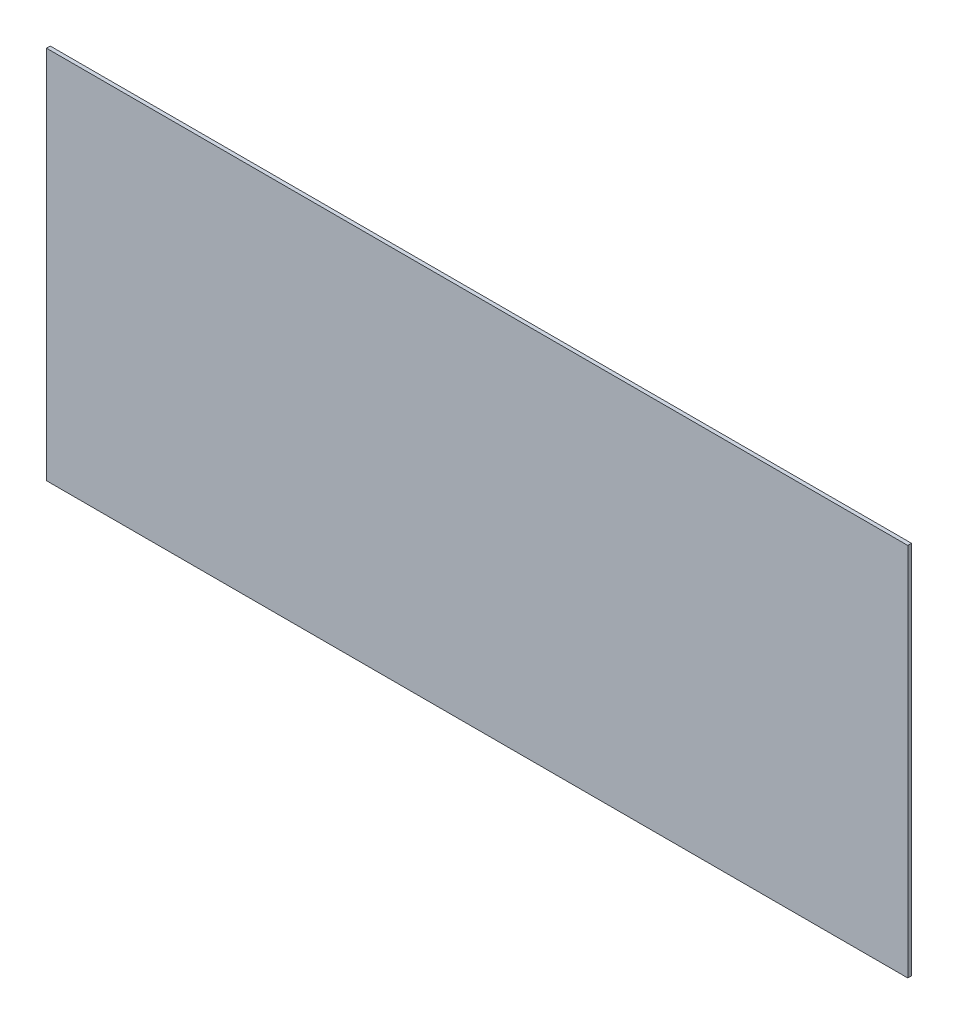
ISO-10303-21;
HEADER;
FILE_DESCRIPTION(('STEP AP214'),'2;1');
FILE_NAME('part.step','',(''),(''),'','','');
FILE_SCHEMA(('AUTOMOTIVE_DESIGN { 1 0 10303 214 1 1 1 1 }'));
ENDSEC;
DATA;
#1=APPLICATION_CONTEXT('core data for automotive mechanical design processes');
#2=APPLICATION_PROTOCOL_DEFINITION('international standard','automotive_design',2000,#1);
#3=PRODUCT_CONTEXT('',#1,'mechanical');
#4=PRODUCT('Part','Part','',(#3));
#5=PRODUCT_RELATED_PRODUCT_CATEGORY('part','',(#4));
#6=PRODUCT_DEFINITION_FORMATION('','',#4);
#7=PRODUCT_DEFINITION_CONTEXT('part definition',#1,'design');
#8=PRODUCT_DEFINITION('design','',#6,#7);
#9=PRODUCT_DEFINITION_SHAPE('','',#8);
#10=(LENGTH_UNIT() NAMED_UNIT(*) SI_UNIT(.MILLI.,.METRE.));
#11=(NAMED_UNIT(*) PLANE_ANGLE_UNIT() SI_UNIT($,.RADIAN.));
#12=(NAMED_UNIT(*) SI_UNIT($,.STERADIAN.) SOLID_ANGLE_UNIT());
#13=UNCERTAINTY_MEASURE_WITH_UNIT(LENGTH_MEASURE(1.E-05),#10,'distance_accuracy_value','');
#14=(GEOMETRIC_REPRESENTATION_CONTEXT(3) GLOBAL_UNCERTAINTY_ASSIGNED_CONTEXT((#13)) GLOBAL_UNIT_ASSIGNED_CONTEXT((#10,
#11,#12)) REPRESENTATION_CONTEXT('',''));
#15=CARTESIAN_POINT('',(0.,0.,0.));
#16=DIRECTION('',(0.,0.,1.));
#17=DIRECTION('',(1.,0.,0.));
#18=AXIS2_PLACEMENT_3D('',#15,#16,#17);
#19=CARTESIAN_POINT('',(0.,0.,0.));
#20=DIRECTION('',(0.,0.,1.));
#21=DIRECTION('',(1.,0.,0.));
#22=AXIS2_PLACEMENT_3D('',#19,#20,#21);
#23=PLANE('',#22);
#24=DIRECTION('',(1.,0.,0.));
#25=VECTOR('',#24,1.);
#26=CARTESIAN_POINT('',(-14.6,6.35,0.));
#27=LINE('',#26,#25);
#28=CARTESIAN_POINT('',(-14.6,6.35,0.));
#29=VERTEX_POINT('',#28);
#30=CARTESIAN_POINT('',(14.6,6.35,0.));
#31=VERTEX_POINT('',#30);
#32=EDGE_CURVE('E57',#29,#31,#27,.T.);
#33=ORIENTED_EDGE('',*,*,#32,.T.);
#34=DIRECTION('',(0.,-1.,0.));
#35=VECTOR('',#34,1.);
#36=CARTESIAN_POINT('',(14.6,6.35,0.));
#37=LINE('',#36,#35);
#38=CARTESIAN_POINT('',(14.6,-6.35,0.));
#39=VERTEX_POINT('',#38);
#40=EDGE_CURVE('E20',#31,#39,#37,.T.);
#41=ORIENTED_EDGE('',*,*,#40,.T.);
#42=DIRECTION('',(1.,0.,0.));
#43=VECTOR('',#42,1.);
#44=CARTESIAN_POINT('',(-14.6,-6.35,0.));
#45=LINE('',#44,#43);
#46=CARTESIAN_POINT('',(-14.6,-6.35,0.));
#47=VERTEX_POINT('',#46);
#48=EDGE_CURVE('E80',#39,#47,#45,.F.);
#49=ORIENTED_EDGE('',*,*,#48,.T.);
#50=DIRECTION('',(0.,1.,0.));
#51=VECTOR('',#50,1.);
#52=CARTESIAN_POINT('',(-14.6,6.35,0.));
#53=LINE('',#52,#51);
#54=EDGE_CURVE('E55',#47,#29,#53,.T.);
#55=ORIENTED_EDGE('',*,*,#54,.T.);
#56=EDGE_LOOP('',(#33,#41,#49,#55));
#57=FACE_BOUND('',#56,.T.);
#58=ADVANCED_FACE('F17',(#57),#23,.F.);
#59=CARTESIAN_POINT('',(14.6,6.35,0.127));
#60=DIRECTION('',(-1.,0.,0.));
#61=DIRECTION('',(0.,-1.,0.));
#62=AXIS2_PLACEMENT_3D('',#59,#60,#61);
#63=PLANE('',#62);
#64=DIRECTION('',(0.,0.,1.));
#65=VECTOR('',#64,1.);
#66=CARTESIAN_POINT('',(14.6,-6.35,0.127));
#67=LINE('',#66,#65);
#68=CARTESIAN_POINT('',(14.6,-6.35,0.127));
#69=VERTEX_POINT('',#68);
#70=EDGE_CURVE('E68',#69,#39,#67,.F.);
#71=ORIENTED_EDGE('',*,*,#70,.T.);
#72=ORIENTED_EDGE('',*,*,#40,.F.);
#73=DIRECTION('',(0.,0.,-1.));
#74=VECTOR('',#73,1.);
#75=CARTESIAN_POINT('',(14.6,6.35,0.127));
#76=LINE('',#75,#74);
#77=CARTESIAN_POINT('',(14.6,6.35,0.127));
#78=VERTEX_POINT('',#77);
#79=EDGE_CURVE('E63',#31,#78,#76,.F.);
#80=ORIENTED_EDGE('',*,*,#79,.T.);
#81=DIRECTION('',(0.,1.,0.));
#82=VECTOR('',#81,1.);
#83=CARTESIAN_POINT('',(14.6,0.,0.127));
#84=LINE('',#83,#82);
#85=EDGE_CURVE('E83',#69,#78,#84,.T.);
#86=ORIENTED_EDGE('',*,*,#85,.F.);
#87=EDGE_LOOP('',(#71,#72,#80,#86));
#88=FACE_BOUND('',#87,.T.);
#89=ADVANCED_FACE('F65',(#88),#63,.F.);
#90=CARTESIAN_POINT('',(-14.6,6.35,0.127));
#91=DIRECTION('',(0.,-1.,0.));
#92=DIRECTION('',(0.,0.,-1.));
#93=AXIS2_PLACEMENT_3D('',#90,#91,#92);
#94=PLANE('',#93);
#95=ORIENTED_EDGE('',*,*,#79,.F.);
#96=ORIENTED_EDGE('',*,*,#32,.F.);
#97=DIRECTION('',(0.,0.,1.));
#98=VECTOR('',#97,1.);
#99=CARTESIAN_POINT('',(-14.6,6.35,0.127));
#100=LINE('',#99,#98);
#101=CARTESIAN_POINT('',(-14.6,6.35,0.127));
#102=VERTEX_POINT('',#101);
#103=EDGE_CURVE('E75',#29,#102,#100,.T.);
#104=ORIENTED_EDGE('',*,*,#103,.T.);
#105=DIRECTION('',(1.,0.,0.));
#106=VECTOR('',#105,1.);
#107=CARTESIAN_POINT('',(0.,6.35,0.127));
#108=LINE('',#107,#106);
#109=EDGE_CURVE('E72',#78,#102,#108,.F.);
#110=ORIENTED_EDGE('',*,*,#109,.F.);
#111=EDGE_LOOP('',(#95,#96,#104,#110));
#112=FACE_BOUND('',#111,.T.);
#113=ADVANCED_FACE('F70',(#112),#94,.F.);
#114=CARTESIAN_POINT('',(-14.6,6.35,0.127));
#115=DIRECTION('',(1.,0.,0.));
#116=DIRECTION('',(0.,1.,0.));
#117=AXIS2_PLACEMENT_3D('',#114,#115,#116);
#118=PLANE('',#117);
#119=ORIENTED_EDGE('',*,*,#103,.F.);
#120=ORIENTED_EDGE('',*,*,#54,.F.);
#121=DIRECTION('',(0.,0.,1.));
#122=VECTOR('',#121,1.);
#123=CARTESIAN_POINT('',(-14.6,-6.35,0.127));
#124=LINE('',#123,#122);
#125=CARTESIAN_POINT('',(-14.6,-6.35,0.127));
#126=VERTEX_POINT('',#125);
#127=EDGE_CURVE('E35',#47,#126,#124,.T.);
#128=ORIENTED_EDGE('',*,*,#127,.T.);
#129=DIRECTION('',(0.,1.,0.));
#130=VECTOR('',#129,1.);
#131=CARTESIAN_POINT('',(-14.6,0.,0.127));
#132=LINE('',#131,#130);
#133=EDGE_CURVE('E26',#102,#126,#132,.F.);
#134=ORIENTED_EDGE('',*,*,#133,.F.);
#135=EDGE_LOOP('',(#119,#120,#128,#134));
#136=FACE_BOUND('',#135,.T.);
#137=ADVANCED_FACE('F89',(#136),#118,.F.);
#138=CARTESIAN_POINT('',(-14.6,-6.35,0.127));
#139=DIRECTION('',(0.,1.,0.));
#140=DIRECTION('',(0.,0.,1.));
#141=AXIS2_PLACEMENT_3D('',#138,#139,#140);
#142=PLANE('',#141);
#143=ORIENTED_EDGE('',*,*,#127,.F.);
#144=ORIENTED_EDGE('',*,*,#48,.F.);
#145=ORIENTED_EDGE('',*,*,#70,.F.);
#146=DIRECTION('',(1.,0.,0.));
#147=VECTOR('',#146,1.);
#148=CARTESIAN_POINT('',(0.,-6.35,0.127));
#149=LINE('',#148,#147);
#150=EDGE_CURVE('E11',#126,#69,#149,.T.);
#151=ORIENTED_EDGE('',*,*,#150,.F.);
#152=EDGE_LOOP('',(#143,#144,#145,#151));
#153=FACE_BOUND('',#152,.T.);
#154=ADVANCED_FACE('F91',(#153),#142,.F.);
#155=CARTESIAN_POINT('',(0.,0.,0.127));
#156=DIRECTION('',(0.,0.,1.));
#157=DIRECTION('',(1.,0.,0.));
#158=AXIS2_PLACEMENT_3D('',#155,#156,#157);
#159=PLANE('',#158);
#160=ORIENTED_EDGE('',*,*,#133,.T.);
#161=ORIENTED_EDGE('',*,*,#150,.T.);
#162=ORIENTED_EDGE('',*,*,#85,.T.);
#163=ORIENTED_EDGE('',*,*,#109,.T.);
#164=EDGE_LOOP('',(#160,#161,#162,#163));
#165=FACE_BOUND('',#164,.T.);
#166=ADVANCED_FACE('F88',(#165),#159,.T.);
#167=CLOSED_SHELL('',(#58,#89,#113,#137,#154,#166));
#168=MANIFOLD_SOLID_BREP('B1',#167);
#169=ADVANCED_BREP_SHAPE_REPRESENTATION('',(#18,#168),#14);
#170=SHAPE_DEFINITION_REPRESENTATION(#9,#169);
ENDSEC;
END-ISO-10303-21;
